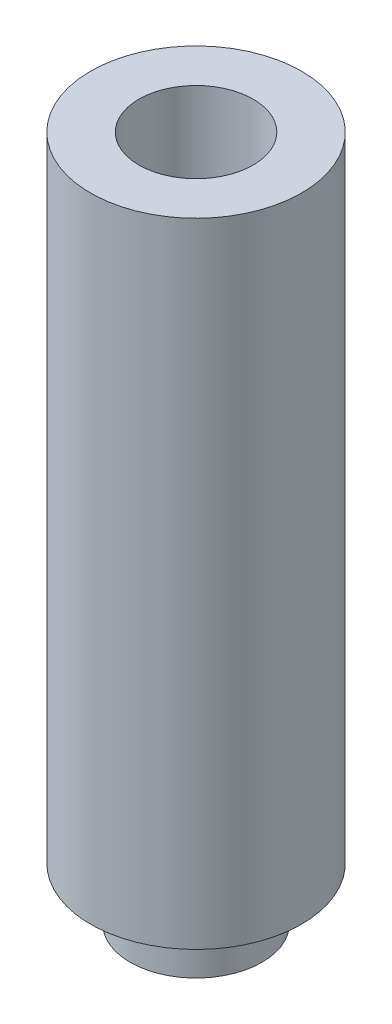
ISO-10303-21;
HEADER;
FILE_DESCRIPTION(('STEP AP214'),'2;1');
FILE_NAME('part.step','',(''),(''),'','','');
FILE_SCHEMA(('AUTOMOTIVE_DESIGN { 1 0 10303 214 1 1 1 1 }'));
ENDSEC;
DATA;
#1=APPLICATION_CONTEXT('core data for automotive mechanical design processes');
#2=APPLICATION_PROTOCOL_DEFINITION('international standard','automotive_design',2000,#1);
#3=PRODUCT_CONTEXT('',#1,'mechanical');
#4=PRODUCT('Part','Part','',(#3));
#5=PRODUCT_RELATED_PRODUCT_CATEGORY('part','',(#4));
#6=PRODUCT_DEFINITION_FORMATION('','',#4);
#7=PRODUCT_DEFINITION_CONTEXT('part definition',#1,'design');
#8=PRODUCT_DEFINITION('design','',#6,#7);
#9=PRODUCT_DEFINITION_SHAPE('','',#8);
#10=(LENGTH_UNIT() NAMED_UNIT(*) SI_UNIT(.MILLI.,.METRE.));
#11=(NAMED_UNIT(*) PLANE_ANGLE_UNIT() SI_UNIT($,.RADIAN.));
#12=(NAMED_UNIT(*) SI_UNIT($,.STERADIAN.) SOLID_ANGLE_UNIT());
#13=UNCERTAINTY_MEASURE_WITH_UNIT(LENGTH_MEASURE(1.E-05),#10,'distance_accuracy_value','');
#14=(GEOMETRIC_REPRESENTATION_CONTEXT(3) GLOBAL_UNCERTAINTY_ASSIGNED_CONTEXT((#13)) GLOBAL_UNIT_ASSIGNED_CONTEXT((#10,
#11,#12)) REPRESENTATION_CONTEXT('',''));
#15=CARTESIAN_POINT('',(0.,0.,0.));
#16=DIRECTION('',(0.,0.,1.));
#17=DIRECTION('',(1.,0.,0.));
#18=AXIS2_PLACEMENT_3D('',#15,#16,#17);
#19=CARTESIAN_POINT('',(0.,15.24,0.));
#20=DIRECTION('',(0.,-1.,0.));
#21=DIRECTION('',(0.,0.,-1.));
#22=AXIS2_PLACEMENT_3D('',#19,#20,#21);
#23=CYLINDRICAL_SURFACE('',#22,2.54);
#24=CARTESIAN_POINT('',(0.,15.24,0.));
#25=DIRECTION('',(0.,1.,0.));
#26=DIRECTION('',(0.,0.,1.));
#27=AXIS2_PLACEMENT_3D('',#24,#25,#26);
#28=CIRCLE('',#27,2.54);
#29=CARTESIAN_POINT('',(0.,15.24,-2.54));
#30=VERTEX_POINT('',#29);
#31=EDGE_CURVE('E44',#30,#30,#28,.T.);
#32=CARTESIAN_POINT('',(0.,0.,0.));
#33=DIRECTION('',(0.,1.,0.));
#34=DIRECTION('',(0.,0.,1.));
#35=AXIS2_PLACEMENT_3D('',#32,#33,#34);
#36=CIRCLE('',#35,2.54);
#37=CARTESIAN_POINT('',(0.,0.,-2.54));
#38=VERTEX_POINT('',#37);
#39=EDGE_CURVE('E48',#38,#38,#36,.T.);
#40=CARTESIAN_POINT('',(0.,15.24,-2.54));
#41=CARTESIAN_POINT('',(0.,15.08125,-2.54));
#42=CARTESIAN_POINT('',(0.,14.9225,-2.54));
#43=CARTESIAN_POINT('',(0.,14.605,-2.54));
#44=CARTESIAN_POINT('',(0.,14.44625,-2.54));
#45=CARTESIAN_POINT('',(0.,14.12875,-2.54));
#46=CARTESIAN_POINT('',(0.,13.97,-2.54));
#47=CARTESIAN_POINT('',(0.,13.6525,-2.54));
#48=CARTESIAN_POINT('',(0.,13.49375,-2.54));
#49=CARTESIAN_POINT('',(0.,13.17625,-2.54));
#50=CARTESIAN_POINT('',(0.,13.0175,-2.54));
#51=CARTESIAN_POINT('',(0.,12.7,-2.54));
#52=CARTESIAN_POINT('',(0.,12.54125,-2.54));
#53=CARTESIAN_POINT('',(0.,12.22375,-2.54));
#54=CARTESIAN_POINT('',(0.,12.065,-2.54));
#55=CARTESIAN_POINT('',(0.,11.7475,-2.54));
#56=CARTESIAN_POINT('',(0.,11.58875,-2.54));
#57=CARTESIAN_POINT('',(0.,11.27125,-2.54));
#58=CARTESIAN_POINT('',(0.,11.1125,-2.54));
#59=CARTESIAN_POINT('',(0.,10.795,-2.54));
#60=CARTESIAN_POINT('',(0.,10.63625,-2.54));
#61=CARTESIAN_POINT('',(0.,10.31875,-2.54));
#62=CARTESIAN_POINT('',(0.,10.16,-2.54));
#63=CARTESIAN_POINT('',(0.,9.8425,-2.54));
#64=CARTESIAN_POINT('',(0.,9.68375,-2.54));
#65=CARTESIAN_POINT('',(0.,9.36625,-2.54));
#66=CARTESIAN_POINT('',(0.,9.2075,-2.54));
#67=CARTESIAN_POINT('',(0.,8.89,-2.54));
#68=CARTESIAN_POINT('',(0.,8.73125,-2.54));
#69=CARTESIAN_POINT('',(0.,8.41375,-2.54));
#70=CARTESIAN_POINT('',(0.,8.255,-2.54));
#71=CARTESIAN_POINT('',(0.,7.9375,-2.54));
#72=CARTESIAN_POINT('',(0.,7.77875,-2.54));
#73=CARTESIAN_POINT('',(0.,7.46125,-2.54));
#74=CARTESIAN_POINT('',(0.,7.3025,-2.54));
#75=CARTESIAN_POINT('',(0.,6.985,-2.54));
#76=CARTESIAN_POINT('',(0.,6.82625,-2.54));
#77=CARTESIAN_POINT('',(0.,6.50875,-2.54));
#78=CARTESIAN_POINT('',(0.,6.35,-2.54));
#79=CARTESIAN_POINT('',(0.,6.0325,-2.54));
#80=CARTESIAN_POINT('',(0.,5.87375,-2.54));
#81=CARTESIAN_POINT('',(0.,5.55625,-2.54));
#82=CARTESIAN_POINT('',(0.,5.3975,-2.54));
#83=CARTESIAN_POINT('',(0.,5.08,-2.54));
#84=CARTESIAN_POINT('',(0.,4.92125,-2.54));
#85=CARTESIAN_POINT('',(0.,4.60375,-2.54));
#86=CARTESIAN_POINT('',(0.,4.445,-2.54));
#87=CARTESIAN_POINT('',(0.,4.1275,-2.54));
#88=CARTESIAN_POINT('',(0.,3.96875,-2.54));
#89=CARTESIAN_POINT('',(0.,3.65125,-2.54));
#90=CARTESIAN_POINT('',(0.,3.4925,-2.54));
#91=CARTESIAN_POINT('',(0.,3.175,-2.54));
#92=CARTESIAN_POINT('',(0.,3.01625,-2.54));
#93=CARTESIAN_POINT('',(0.,2.69875,-2.54));
#94=CARTESIAN_POINT('',(0.,2.54,-2.54));
#95=CARTESIAN_POINT('',(0.,2.2225,-2.54));
#96=CARTESIAN_POINT('',(0.,2.06375,-2.54));
#97=CARTESIAN_POINT('',(0.,1.74625,-2.54));
#98=CARTESIAN_POINT('',(0.,1.5875,-2.54));
#99=CARTESIAN_POINT('',(0.,1.27,-2.54));
#100=CARTESIAN_POINT('',(0.,1.11125,-2.54));
#101=CARTESIAN_POINT('',(0.,0.79375,-2.54));
#102=CARTESIAN_POINT('',(0.,0.634999999999999,-2.54));
#103=CARTESIAN_POINT('',(0.,0.3175,-2.54));
#104=CARTESIAN_POINT('',(0.,0.15875,-2.54));
#105=CARTESIAN_POINT('',(0.,0.,-2.54));
#106=B_SPLINE_CURVE_WITH_KNOTS('',3,(#40,#41,#42,#43,#44,#45,#46,#47,#48,#49,#50,#51,#52,#53,
#54,#55,#56,#57,#58,#59,#60,#61,#62,#63,#64,#65,#66,#67,#68,#69,#70,#71,#72,#73,#74,#75,#76,#77,
#78,#79,#80,#81,#82,#83,#84,#85,#86,#87,#88,#89,#90,#91,#92,#93,#94,#95,#96,#97,#98,#99,#100,
#101,#102,#103,#104,#105),.UNSPECIFIED.,.F.,.F.,(4,2,2,2,2,2,2,2,2,2,2,2,2,2,2,2,2,2,2,2,2,2,2,
2,2,2,2,2,2,2,2,2,4),(0.,0.476250000000001,0.9525,1.42875,1.905,2.38125,2.8575,3.33375,3.81,
4.28625,4.7625,5.23875,5.715,6.19125,6.6675,7.14375,7.62,8.09625,8.5725,9.04875,9.525,10.00125,
10.4775,10.95375,11.43,11.90625,12.3825,12.85875,13.335,13.81125,14.2875,14.76375,15.24),.UNSPECIFIED.);
#107=EDGE_CURVE('BSEAM38',#30,#38,#106,.T.);
#108=ORIENTED_EDGE('',*,*,#31,.F.);
#109=ORIENTED_EDGE('',*,*,#39,.T.);
#110=ORIENTED_EDGE('',*,*,#107,.T.);
#111=ORIENTED_EDGE('',*,*,#107,.F.);
#112=EDGE_LOOP('',(#108,#110,#109,#111));
#113=FACE_BOUND('',#112,.T.);
#114=ADVANCED_FACE('F38',(#113),#23,.T.);
#115=CARTESIAN_POINT('',(0.,15.24,0.));
#116=DIRECTION('',(0.,1.,0.));
#117=DIRECTION('',(0.,0.,1.));
#118=AXIS2_PLACEMENT_3D('',#115,#116,#117);
#119=PLANE('',#118);
#120=CARTESIAN_POINT('',(0.,15.24,0.));
#121=DIRECTION('',(0.,1.,0.));
#122=DIRECTION('',(0.,0.,1.));
#123=AXIS2_PLACEMENT_3D('',#120,#121,#122);
#124=CIRCLE('',#123,1.375);
#125=CARTESIAN_POINT('',(0.,15.24,1.375));
#126=VERTEX_POINT('',#125);
#127=EDGE_CURVE('E55',#126,#126,#124,.T.);
#128=ORIENTED_EDGE('',*,*,#127,.F.);
#129=EDGE_LOOP('',(#128));
#130=FACE_BOUND('',#129,.T.);
#131=ORIENTED_EDGE('',*,*,#31,.T.);
#132=EDGE_LOOP('',(#131));
#133=FACE_BOUND('',#132,.T.);
#134=ADVANCED_FACE('F90',(#130,#133),#119,.T.);
#135=CARTESIAN_POINT('',(0.,0.,0.));
#136=DIRECTION('',(0.,1.,0.));
#137=DIRECTION('',(0.,0.,1.));
#138=AXIS2_PLACEMENT_3D('',#135,#136,#137);
#139=PLANE('',#138);
#140=CARTESIAN_POINT('',(0.,0.,0.));
#141=DIRECTION('',(0.,1.,0.));
#142=DIRECTION('',(0.,0.,1.));
#143=AXIS2_PLACEMENT_3D('',#140,#141,#142);
#144=CIRCLE('',#143,1.5875);
#145=CARTESIAN_POINT('',(0.,0.,1.5875));
#146=VERTEX_POINT('',#145);
#147=EDGE_CURVE('E11',#146,#146,#144,.F.);
#148=ORIENTED_EDGE('',*,*,#147,.F.);
#149=EDGE_LOOP('',(#148));
#150=FACE_BOUND('',#149,.T.);
#151=ORIENTED_EDGE('',*,*,#39,.F.);
#152=EDGE_LOOP('',(#151));
#153=FACE_BOUND('',#152,.T.);
#154=ADVANCED_FACE('F95',(#150,#153),#139,.F.);
#155=CARTESIAN_POINT('',(0.,2.54,0.));
#156=DIRECTION('',(0.,1.,0.));
#157=DIRECTION('',(0.,0.,1.));
#158=AXIS2_PLACEMENT_3D('',#155,#156,#157);
#159=CYLINDRICAL_SURFACE('',#158,1.375);
#160=CARTESIAN_POINT('',(0.,2.54,0.));
#161=DIRECTION('',(0.,1.,0.));
#162=DIRECTION('',(0.,0.,1.));
#163=AXIS2_PLACEMENT_3D('',#160,#161,#162);
#164=CIRCLE('',#163,1.375);
#165=CARTESIAN_POINT('',(0.,2.54,1.375));
#166=VERTEX_POINT('',#165);
#167=EDGE_CURVE('E53',#166,#166,#164,.T.);
#168=CARTESIAN_POINT('',(0.,2.54,1.375));
#169=CARTESIAN_POINT('',(0.,2.67229166666666,1.375));
#170=CARTESIAN_POINT('',(0.,2.80458333333333,1.375));
#171=CARTESIAN_POINT('',(0.,3.06916666666666,1.375));
#172=CARTESIAN_POINT('',(0.,3.20145833333333,1.375));
#173=CARTESIAN_POINT('',(0.,3.46604166666666,1.375));
#174=CARTESIAN_POINT('',(0.,3.59833333333333,1.375));
#175=CARTESIAN_POINT('',(0.,3.86291666666666,1.375));
#176=CARTESIAN_POINT('',(0.,3.99520833333333,1.375));
#177=CARTESIAN_POINT('',(0.,4.25979166666666,1.375));
#178=CARTESIAN_POINT('',(0.,4.39208333333333,1.375));
#179=CARTESIAN_POINT('',(0.,4.65666666666666,1.375));
#180=CARTESIAN_POINT('',(0.,4.78895833333333,1.375));
#181=CARTESIAN_POINT('',(0.,5.05354166666666,1.375));
#182=CARTESIAN_POINT('',(0.,5.18583333333333,1.375));
#183=CARTESIAN_POINT('',(0.,5.45041666666666,1.375));
#184=CARTESIAN_POINT('',(0.,5.58270833333333,1.375));
#185=CARTESIAN_POINT('',(0.,5.84729166666666,1.375));
#186=CARTESIAN_POINT('',(0.,5.97958333333333,1.375));
#187=CARTESIAN_POINT('',(0.,6.24416666666666,1.375));
#188=CARTESIAN_POINT('',(0.,6.37645833333333,1.375));
#189=CARTESIAN_POINT('',(0.,6.64104166666666,1.375));
#190=CARTESIAN_POINT('',(0.,6.77333333333333,1.375));
#191=CARTESIAN_POINT('',(0.,7.03791666666666,1.375));
#192=CARTESIAN_POINT('',(0.,7.17020833333333,1.375));
#193=CARTESIAN_POINT('',(0.,7.43479166666666,1.375));
#194=CARTESIAN_POINT('',(0.,7.56708333333333,1.375));
#195=CARTESIAN_POINT('',(0.,7.83166666666666,1.375));
#196=CARTESIAN_POINT('',(0.,7.96395833333333,1.375));
#197=CARTESIAN_POINT('',(0.,8.22854166666666,1.375));
#198=CARTESIAN_POINT('',(0.,8.36083333333333,1.375));
#199=CARTESIAN_POINT('',(0.,8.62541666666666,1.375));
#200=CARTESIAN_POINT('',(0.,8.75770833333333,1.375));
#201=CARTESIAN_POINT('',(0.,9.02229166666666,1.375));
#202=CARTESIAN_POINT('',(0.,9.15458333333333,1.375));
#203=CARTESIAN_POINT('',(0.,9.41916666666666,1.375));
#204=CARTESIAN_POINT('',(0.,9.55145833333333,1.375));
#205=CARTESIAN_POINT('',(0.,9.81604166666667,1.375));
#206=CARTESIAN_POINT('',(0.,9.94833333333333,1.375));
#207=CARTESIAN_POINT('',(0.,10.2129166666667,1.375));
#208=CARTESIAN_POINT('',(0.,10.3452083333333,1.375));
#209=CARTESIAN_POINT('',(0.,10.6097916666667,1.375));
#210=CARTESIAN_POINT('',(0.,10.7420833333333,1.375));
#211=CARTESIAN_POINT('',(0.,11.0066666666667,1.375));
#212=CARTESIAN_POINT('',(0.,11.1389583333333,1.375));
#213=CARTESIAN_POINT('',(0.,11.4035416666667,1.375));
#214=CARTESIAN_POINT('',(0.,11.5358333333333,1.375));
#215=CARTESIAN_POINT('',(0.,11.8004166666667,1.375));
#216=CARTESIAN_POINT('',(0.,11.9327083333333,1.375));
#217=CARTESIAN_POINT('',(0.,12.1972916666667,1.375));
#218=CARTESIAN_POINT('',(0.,12.3295833333333,1.375));
#219=CARTESIAN_POINT('',(0.,12.5941666666667,1.375));
#220=CARTESIAN_POINT('',(0.,12.7264583333333,1.375));
#221=CARTESIAN_POINT('',(0.,12.9910416666667,1.375));
#222=CARTESIAN_POINT('',(0.,13.1233333333333,1.375));
#223=CARTESIAN_POINT('',(0.,13.3879166666667,1.375));
#224=CARTESIAN_POINT('',(0.,13.5202083333333,1.375));
#225=CARTESIAN_POINT('',(0.,13.7847916666667,1.375));
#226=CARTESIAN_POINT('',(0.,13.9170833333333,1.375));
#227=CARTESIAN_POINT('',(0.,14.1816666666667,1.375));
#228=CARTESIAN_POINT('',(0.,14.3139583333333,1.375));
#229=CARTESIAN_POINT('',(0.,14.5785416666667,1.375));
#230=CARTESIAN_POINT('',(0.,14.7108333333333,1.375));
#231=CARTESIAN_POINT('',(0.,14.9754166666667,1.375));
#232=CARTESIAN_POINT('',(0.,15.1077083333333,1.375));
#233=CARTESIAN_POINT('',(0.,15.24,1.375));
#234=B_SPLINE_CURVE_WITH_KNOTS('',3,(#168,#169,#170,#171,#172,#173,#174,#175,#176,#177,#178,
#179,#180,#181,#182,#183,#184,#185,#186,#187,#188,#189,#190,#191,#192,#193,#194,#195,#196,#197,
#198,#199,#200,#201,#202,#203,#204,#205,#206,#207,#208,#209,#210,#211,#212,#213,#214,#215,#216,
#217,#218,#219,#220,#221,#222,#223,#224,#225,#226,#227,#228,#229,#230,#231,#232,#233),
.UNSPECIFIED.,.F.,.F.,(4,2,2,2,2,2,2,2,2,2,2,2,2,2,2,2,2,2,2,2,2,2,2,2,2,2,2,2,2,2,2,2,4),(0.,
0.396875,0.79375,1.190625,1.5875,1.984375,2.38125,2.778125,3.175,3.571875,3.96875,4.365625,
4.7625,5.159375,5.55625,5.953125,6.35,6.746875,7.14375,7.540625,7.9375,8.334375,8.73125,
9.128125,9.525,9.921875,10.31875,10.715625,11.1125,11.509375,11.90625,12.303125,12.7),.UNSPECIFIED.);
#235=EDGE_CURVE('BSEAM85',#166,#126,#234,.T.);
#236=ORIENTED_EDGE('',*,*,#167,.F.);
#237=ORIENTED_EDGE('',*,*,#127,.T.);
#238=ORIENTED_EDGE('',*,*,#235,.T.);
#239=ORIENTED_EDGE('',*,*,#235,.F.);
#240=EDGE_LOOP('',(#236,#238,#237,#239));
#241=FACE_BOUND('',#240,.T.);
#242=ADVANCED_FACE('F85',(#241),#159,.F.);
#243=CARTESIAN_POINT('',(0.,2.54,0.));
#244=DIRECTION('',(0.,1.,0.));
#245=DIRECTION('',(0.,0.,1.));
#246=AXIS2_PLACEMENT_3D('',#243,#244,#245);
#247=PLANE('',#246);
#248=ORIENTED_EDGE('',*,*,#167,.T.);
#249=EDGE_LOOP('',(#248));
#250=FACE_BOUND('',#249,.T.);
#251=ADVANCED_FACE('F76',(#250),#247,.T.);
#252=CARTESIAN_POINT('',(0.,-1.27,0.));
#253=DIRECTION('',(0.,-1.,0.));
#254=DIRECTION('',(0.,0.,-1.));
#255=AXIS2_PLACEMENT_3D('',#252,#253,#254);
#256=PLANE('',#255);
#257=CARTESIAN_POINT('',(0.,-1.27,0.));
#258=DIRECTION('',(0.,-1.,0.));
#259=DIRECTION('',(0.,0.,-1.));
#260=AXIS2_PLACEMENT_3D('',#257,#258,#259);
#261=CIRCLE('',#260,1.5875);
#262=CARTESIAN_POINT('',(0.,-1.27,-1.5875));
#263=VERTEX_POINT('',#262);
#264=EDGE_CURVE('E58',#263,#263,#261,.T.);
#265=ORIENTED_EDGE('',*,*,#264,.T.);
#266=EDGE_LOOP('',(#265));
#267=FACE_BOUND('',#266,.T.);
#268=CARTESIAN_POINT('',(0.,-1.27,0.));
#269=DIRECTION('',(0.,-1.,0.));
#270=DIRECTION('',(1.,0.,0.));
#271=AXIS2_PLACEMENT_3D('',#268,#269,#270);
#272=CIRCLE('',#271,1.3335);
#273=CARTESIAN_POINT('',(1.3335,-1.27,0.));
#274=VERTEX_POINT('',#273);
#275=EDGE_CURVE('E63',#274,#274,#272,.T.);
#276=ORIENTED_EDGE('',*,*,#275,.F.);
#277=EDGE_LOOP('',(#276));
#278=FACE_BOUND('',#277,.T.);
#279=ADVANCED_FACE('F73',(#267,#278),#256,.T.);
#280=CARTESIAN_POINT('',(0.,-1.27,0.));
#281=DIRECTION('',(0.,1.,0.));
#282=DIRECTION('',(0.,0.,1.));
#283=AXIS2_PLACEMENT_3D('',#280,#281,#282);
#284=CYLINDRICAL_SURFACE('',#283,1.5875);
#285=ORIENTED_EDGE('',*,*,#264,.F.);
#286=EDGE_LOOP('',(#285));
#287=FACE_BOUND('',#286,.T.);
#288=ORIENTED_EDGE('',*,*,#147,.T.);
#289=EDGE_LOOP('',(#288));
#290=FACE_BOUND('',#289,.T.);
#291=ADVANCED_FACE('F75',(#287,#290),#284,.T.);
#292=CARTESIAN_POINT('',(0.,-1.27,0.));
#293=DIRECTION('',(0.,1.,0.));
#294=DIRECTION('',(0.,0.,1.));
#295=AXIS2_PLACEMENT_3D('',#292,#293,#294);
#296=CYLINDRICAL_SURFACE('',#295,1.3335);
#297=ORIENTED_EDGE('',*,*,#275,.T.);
#298=EDGE_LOOP('',(#297));
#299=FACE_BOUND('',#298,.T.);
#300=CARTESIAN_POINT('',(0.,0.,0.));
#301=DIRECTION('',(0.,-1.,0.));
#302=DIRECTION('',(1.,0.,0.));
#303=AXIS2_PLACEMENT_3D('',#300,#301,#302);
#304=CIRCLE('',#303,1.3335);
#305=CARTESIAN_POINT('',(1.3335,0.,0.));
#306=VERTEX_POINT('',#305);
#307=EDGE_CURVE('E64',#306,#306,#304,.T.);
#308=ORIENTED_EDGE('',*,*,#307,.F.);
#309=EDGE_LOOP('',(#308));
#310=FACE_BOUND('',#309,.T.);
#311=ADVANCED_FACE('F70',(#299,#310),#296,.F.);
#312=ORIENTED_EDGE('',*,*,#307,.T.);
#313=EDGE_LOOP('',(#312));
#314=FACE_BOUND('',#313,.T.);
#315=ADVANCED_FACE('F103',(#314),#139,.F.);
#316=CLOSED_SHELL('',(#114,#134,#154,#242,#251,#279,#291,#311,#315));
#317=MANIFOLD_SOLID_BREP('B2',#316);
#318=ADVANCED_BREP_SHAPE_REPRESENTATION('',(#18,#317),#14);
#319=SHAPE_DEFINITION_REPRESENTATION(#9,#318);
ENDSEC;
END-ISO-10303-21;
